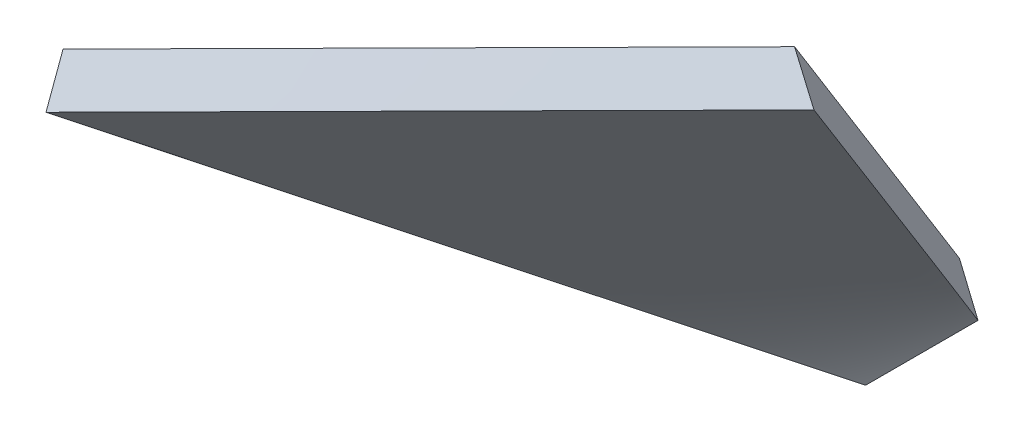
ISO-10303-21;
HEADER;
FILE_DESCRIPTION(('STEP AP214'),'2;1');
FILE_NAME('part.step','',(''),(''),'','','');
FILE_SCHEMA(('AUTOMOTIVE_DESIGN { 1 0 10303 214 1 1 1 1 }'));
ENDSEC;
DATA;
#1=APPLICATION_CONTEXT('core data for automotive mechanical design processes');
#2=APPLICATION_PROTOCOL_DEFINITION('international standard','automotive_design',2000,#1);
#3=PRODUCT_CONTEXT('',#1,'mechanical');
#4=PRODUCT('Part','Part','',(#3));
#5=PRODUCT_RELATED_PRODUCT_CATEGORY('part','',(#4));
#6=PRODUCT_DEFINITION_FORMATION('','',#4);
#7=PRODUCT_DEFINITION_CONTEXT('part definition',#1,'design');
#8=PRODUCT_DEFINITION('design','',#6,#7);
#9=PRODUCT_DEFINITION_SHAPE('','',#8);
#10=(LENGTH_UNIT() NAMED_UNIT(*) SI_UNIT(.MILLI.,.METRE.));
#11=(NAMED_UNIT(*) PLANE_ANGLE_UNIT() SI_UNIT($,.RADIAN.));
#12=(NAMED_UNIT(*) SI_UNIT($,.STERADIAN.) SOLID_ANGLE_UNIT());
#13=UNCERTAINTY_MEASURE_WITH_UNIT(LENGTH_MEASURE(1.E-05),#10,'distance_accuracy_value','');
#14=(GEOMETRIC_REPRESENTATION_CONTEXT(3) GLOBAL_UNCERTAINTY_ASSIGNED_CONTEXT((#13)) GLOBAL_UNIT_ASSIGNED_CONTEXT((#10,
#11,#12)) REPRESENTATION_CONTEXT('',''));
#15=CARTESIAN_POINT('',(0.,0.,0.));
#16=DIRECTION('',(0.,0.,1.));
#17=DIRECTION('',(1.,0.,0.));
#18=AXIS2_PLACEMENT_3D('',#15,#16,#17);
#19=CARTESIAN_POINT('',(-6.22609191666298,361.769121183095,2.73946802342179));
#20=DIRECTION('',(-0.915166256682498,0.0180699960866787,0.402671327351691));
#21=DIRECTION('',(0.402737084534614,0.,0.915315705503057));
#22=AXIS2_PLACEMENT_3D('',#19,#20,#21);
#23=PLANE('',#22);
#24=DIRECTION('',(0.324104895832751,0.626915411174135,0.708472359185315));
#25=VECTOR('',#24,1.);
#26=CARTESIAN_POINT('',(91.5139467042197,44.0928888900743,239.132742342416));
#27=LINE('',#26,#25);
#28=CARTESIAN_POINT('',(84.9758109194033,31.4461867373069,224.84079999998));
#29=VERTEX_POINT('',#28);
#30=CARTESIAN_POINT('',(255.683748074746,361.646186737307,597.997319736598));
#31=VERTEX_POINT('',#30);
#32=EDGE_CURVE('E76',#29,#31,#27,.T.);
#33=ORIENTED_EDGE('',*,*,#32,.T.);
#34=CARTESIAN_POINT('',(252.660470814562,370.070034632344,590.748181243254));
#35=CARTESIAN_POINT('',(252.786295437243,369.718865177392,591.050084969426));
#36=CARTESIAN_POINT('',(252.912138212211,369.36771766812,591.352006657116));
#37=CARTESIAN_POINT('',(253.16386006755,368.665466571563,591.95588594932));
#38=CARTESIAN_POINT('',(253.289739147919,368.314362984277,592.257843553833));
#39=CARTESIAN_POINT('',(253.541533619872,367.612199748406,592.861794685435));
#40=CARTESIAN_POINT('',(253.667449011454,367.261140099821,593.163788212521));
#41=CARTESIAN_POINT('',(253.919316111642,366.559064758072,593.767811195018));
#42=CARTESIAN_POINT('',(254.045267820248,366.208049064908,594.069840650427));
#43=CARTESIAN_POINT('',(254.297207560294,365.506061650728,594.673935495316));
#44=CARTESIAN_POINT('',(254.423195591733,365.155089929712,594.976000884796));
#45=CARTESIAN_POINT('',(254.675207983258,364.453190476563,595.580167603574));
#46=CARTESIAN_POINT('',(254.801232343342,364.102262744428,595.882268932872));
#47=CARTESIAN_POINT('',(255.053317397966,363.400451285779,596.486507537035));
#48=CARTESIAN_POINT('',(255.179378092505,363.049567559265,596.7886448119));
#49=CARTESIAN_POINT('',(255.431535821848,362.347844128601,597.392955312945));
#50=CARTESIAN_POINT('',(255.557632856652,361.997004424452,597.695128539124));
#51=CARTESIAN_POINT('',(255.683748064494,361.646186739859,597.997319743836));
#52=B_SPLINE_CURVE_WITH_KNOTS('',3,(#34,#35,#36,#37,#38,#39,#40,#41,#42,#43,#44,#45,#46,#47,#48,
#49,#50,#51),.UNSPECIFIED.,.F.,.F.,(4,2,2,2,2,2,2,2,4),(0.,1.43968021844362,2.87936038695885,
4.31904051265375,5.75872060264493,7.1984006640563,8.63808070402076,10.0777607296788,
11.5174407481797),.UNSPECIFIED.);
#53=CARTESIAN_POINT('',(252.660470814629,370.070034632494,590.7481812434));
#54=VERTEX_POINT('',#53);
#55=EDGE_CURVE('E206',#54,#31,#52,.T.);
#56=ORIENTED_EDGE('',*,*,#55,.F.);
#57=CARTESIAN_POINT('',(252.607877841896,369.968304155438,590.633216400703));
#58=CARTESIAN_POINT('',(252.6100692319,369.972542927182,590.638006591522));
#59=CARTESIAN_POINT('',(252.612260615543,369.97678169765,590.642796786381));
#60=CARTESIAN_POINT('',(252.616643378325,369.985259237817,590.652377178812));
#61=CARTESIAN_POINT('',(252.618834757465,369.989498007516,590.657167376384));
#62=CARTESIAN_POINT('',(252.623217519803,369.997975548591,590.666747769626));
#63=CARTESIAN_POINT('',(252.625408903001,370.002214319965,590.671537965296));
#64=CARTESIAN_POINT('',(252.629791657491,370.010691860438,590.681118364341));
#65=CARTESIAN_POINT('',(252.631983028783,370.014930629536,590.685908567717));
#66=CARTESIAN_POINT('',(252.636365775217,370.023408169254,590.695488972523));
#67=CARTESIAN_POINT('',(252.638557150359,370.027646939874,590.700279173953));
#68=CARTESIAN_POINT('',(252.642939892818,370.036124479454,590.709859581411));
#69=CARTESIAN_POINT('',(252.645131260135,370.040363248413,590.714649787439));
#70=CARTESIAN_POINT('',(252.649513992975,370.048840786527,590.724230201063));
#71=CARTESIAN_POINT('',(252.651705358498,370.053079555682,590.72902040866));
#72=CARTESIAN_POINT('',(252.656088087227,370.061557093991,590.738600825624));
#73=CARTESIAN_POINT('',(252.658279450433,370.065795863144,590.743391034992));
#74=CARTESIAN_POINT('',(252.66047081216,370.070034632087,590.748181245223));
#75=B_SPLINE_CURVE_WITH_KNOTS('',3,(#57,#58,#59,#60,#61,#62,#63,#64,#65,#66,#67,#68,#69,#70,#71,
#72,#73,#74),.UNSPECIFIED.,.F.,.F.,(4,2,2,2,2,2,2,2,4),(0.,0.0202839280521231,
0.0405678560468412,0.0608517870960308,0.0811357186636942,0.101419652703714,0.121703585782609,
0.14198752082122,0.162271457366975),.UNSPECIFIED.);
#76=CARTESIAN_POINT('',(252.607877841036,369.968304155451,590.633216401594));
#77=VERTEX_POINT('',#76);
#78=EDGE_CURVE('E120',#77,#54,#75,.T.);
#79=ORIENTED_EDGE('',*,*,#78,.F.);
#80=CARTESIAN_POINT('',(252.660470814629,370.070034632494,590.748181243401));
#81=CARTESIAN_POINT('',(250.455464817295,365.804896416015,585.928180608077));
#82=CARTESIAN_POINT('',(248.250426734534,361.5398624806,581.108102371354));
#83=CARTESIAN_POINT('',(243.840276059448,353.010036761755,571.467765690579));
#84=CARTESIAN_POINT('',(241.635163467122,348.745244978327,566.647507246526));
#85=CARTESIAN_POINT('',(237.224853449786,340.215937183471,557.006785180638));
#86=CARTESIAN_POINT('',(235.019656024775,335.951421172043,552.186321558804));
#87=CARTESIAN_POINT('',(230.609163515494,327.422706681706,542.545158111897));
#88=CARTESIAN_POINT('',(228.403868431223,323.158508202795,537.724458286826));
#89=CARTESIAN_POINT('',(223.993057843438,314.630270627772,528.082550529233));
#90=CARTESIAN_POINT('',(221.787542334418,310.366231549558,523.261342583399));
#91=CARTESIAN_POINT('',(217.376379866612,301.838580881307,513.618608757244));
#92=CARTESIAN_POINT('',(215.170732907825,297.57496929127,508.797082876923));
#93=CARTESIAN_POINT('',(210.759284973051,289.048247023974,499.153658596994));
#94=CARTESIAN_POINT('',(208.553483997063,284.785136346718,494.331760197384));
#95=CARTESIAN_POINT('',(204.14170026075,276.259506242119,484.687523717552));
#96=CARTESIAN_POINT('',(201.935717500422,271.996986814784,479.865185637322));
#97=CARTESIAN_POINT('',(197.523536371471,263.472652681133,470.219987831226));
#98=CARTESIAN_POINT('',(195.317338002907,259.210837974629,465.397128105499));
#99=CARTESIAN_POINT('',(190.904681863129,250.688053061476,455.750781202714));
#100=CARTESIAN_POINT('',(188.698224091917,246.427082854824,450.927294025659));
#101=CARTESIAN_POINT('',(184.284994366416,237.906165891374,441.279559688248));
#102=CARTESIAN_POINT('',(182.078222412136,233.646219134551,436.455312527911));
#103=CARTESIAN_POINT('',(177.66429390801,225.127578917922,426.805887880367));
#104=CARTESIAN_POINT('',(175.457137358173,220.868885458088,421.980710393181));
#105=CARTESIAN_POINT('',(171.042451427878,212.353250990596,412.32942943083));
#106=CARTESIAN_POINT('',(168.834922069754,208.096309910131,407.503326009693));
#107=CARTESIAN_POINT('',(164.419266004762,199.584376235877,397.84967411156));
#108=CARTESIAN_POINT('',(162.211139297886,195.329383642115,393.022125634544));
#109=CARTESIAN_POINT('',(157.794125255452,186.821880400319,383.365188593073));
#110=CARTESIAN_POINT('',(155.585237919789,182.569369752632,378.53580002836));
#111=CARTESIAN_POINT('',(151.166480456179,174.067555682236,368.874645344802));
#112=CARTESIAN_POINT('',(148.956610327799,169.818252260941,364.04287922491));
#113=CARTESIAN_POINT('',(145.640863267244,163.447540978023,356.792943857616));
#114=CARTESIAN_POINT('',(144.535472682387,161.324540759327,354.375951407537));
#115=CARTESIAN_POINT('',(142.324315083726,157.079775172932,349.541055568862));
#116=CARTESIAN_POINT('',(141.21854807001,154.958009804948,347.123152180477));
#117=CARTESIAN_POINT('',(139.006577448112,150.715916113335,342.286288651264));
#118=CARTESIAN_POINT('',(137.900373840295,148.59558778851,339.867328511319));
#119=CARTESIAN_POINT('',(135.687456260481,144.356614959386,335.028172745629));
#120=CARTESIAN_POINT('',(134.580742289148,142.237970452903,332.607977121494));
#121=CARTESIAN_POINT('',(132.366590317655,138.002429424244,327.765861904381));
#122=CARTESIAN_POINT('',(131.259152251228,135.885533120048,325.343942151015));
#123=CARTESIAN_POINT('',(129.043562153696,131.654090647833,320.49837452687));
#124=CARTESIAN_POINT('',(127.935410122283,129.53954448083,318.074726655344));
#125=CARTESIAN_POINT('',(125.71825172545,125.313256536575,313.225363387462));
#126=CARTESIAN_POINT('',(124.609245357572,123.201514767438,310.799647985157));
#127=CARTESIAN_POINT('',(122.390203452442,118.98140333445,305.945726824408));
#128=CARTESIAN_POINT('',(121.280167909088,116.873033690798,303.517521051187));
#129=CARTESIAN_POINT('',(119.283913166284,113.087219948977,299.150447407224));
#130=CARTESIAN_POINT('',(118.397919705713,111.409026257041,297.212126219958));
#131=CARTESIAN_POINT('',(116.625009807793,108.05572132754,293.333247835361));
#132=CARTESIAN_POINT('',(115.738093372244,106.38061008398,291.392690642391));
#133=CARTESIAN_POINT('',(113.963180037928,103.034045919622,287.508956478766));
#134=CARTESIAN_POINT('',(113.075183150484,101.362592960989,285.565779535544));
#135=CARTESIAN_POINT('',(111.297912961266,98.0240495115435,281.676328927243));
#136=CARTESIAN_POINT('',(110.408639681858,96.3569589457017,279.730055316362));
#137=CARTESIAN_POINT('',(108.628814593227,93.0284598252007,275.834347349901));
#138=CARTESIAN_POINT('',(107.738263237114,91.367049743198,273.884914092657));
#139=CARTESIAN_POINT('',(105.955309313905,88.0504818829457,269.981559687411));
#140=CARTESIAN_POINT('',(105.062906737537,86.3953241361295,268.027638516924));
#141=CARTESIAN_POINT('',(103.275840028819,83.0925588357623,264.114317435509));
#142=CARTESIAN_POINT('',(102.381175815363,81.4449515591164,262.154917327823));
#143=CARTESIAN_POINT('',(100.58907387438,78.1589271206093,258.229401233657));
#144=CARTESIAN_POINT('',(99.6916359428656,76.5205106608704,256.26328475206));
#145=CARTESIAN_POINT('',(98.1918842520484,73.7971139324413,252.976955970429));
#146=CARTESIAN_POINT('',(97.5904860930799,72.7089459078139,251.658967641181));
#147=CARTESIAN_POINT('',(96.3859858307554,70.5385427193834,249.018852125346));
#148=CARTESIAN_POINT('',(95.7828837024745,69.4563076430533,247.696724878186));
#149=CARTESIAN_POINT('',(94.5747545600541,67.2987724446748,245.047784415299));
#150=CARTESIAN_POINT('',(93.9697276143728,66.2234720800145,243.720971366047));
#151=CARTESIAN_POINT('',(92.7574804430895,64.0809775431069,241.061996750046));
#152=CARTESIAN_POINT('',(92.1502603869884,63.0137827633742,239.729835595788));
#153=CARTESIAN_POINT('',(90.9333037335963,60.8888672075956,237.059368700804));
#154=CARTESIAN_POINT('',(90.3235674009036,59.8311454707194,235.721063604556));
#155=CARTESIAN_POINT('',(89.1011898196953,57.726776694878,233.037354320337));
#156=CARTESIAN_POINT('',(88.4885488976155,56.6801284522175,231.691950928284));
#157=CARTESIAN_POINT('',(87.2591905743576,54.5985826947396,228.99135205953));
#158=CARTESIAN_POINT('',(86.6424695356724,53.5636988358729,227.636147702916));
#159=CARTESIAN_POINT('',(85.405086980354,51.5090918874845,224.916102973331));
#160=CARTESIAN_POINT('',(84.7844255221005,50.489368574094,223.551262743089));
#161=CARTESIAN_POINT('',(83.538527449556,48.467678623066,220.810387317432));
#162=CARTESIAN_POINT('',(82.9132905356514,47.4657131632317,219.434351388219));
#163=CARTESIAN_POINT('',(81.6575055312566,45.4825564222407,216.669276371719));
#164=CARTESIAN_POINT('',(81.0269563578638,44.5013695273999,215.280234626441));
#165=CARTESIAN_POINT('',(79.7596924500353,42.5632241829026,212.487051174908));
#166=CARTESIAN_POINT('',(79.1229751225894,41.6062765937276,211.082903088053));
#167=CARTESIAN_POINT('',(78.162694286581,40.1921857500359,208.963894496968));
#168=CARTESIAN_POINT('',(77.8416042831691,39.7241950952155,208.255142401167));
#169=CARTESIAN_POINT('',(77.1976724718567,38.7960381674455,206.833305696204));
#170=CARTESIAN_POINT('',(76.8748306344671,38.3358720267508,206.120221014085));
#171=CARTESIAN_POINT('',(76.5510686541073,37.8799147545906,205.40485621423));
#172=B_SPLINE_CURVE_WITH_KNOTS('',3,(#80,#81,#82,#83,#84,#85,#86,#87,#88,#89,#90,#91,#92,#93,
#94,#95,#96,#97,#98,#99,#100,#101,#102,#103,#104,#105,#106,#107,#108,#109,#110,#111,#112,#113,
#114,#115,#116,#117,#118,#119,#120,#121,#122,#123,#124,#125,#126,#127,#128,#129,#130,#131,#132,
#133,#134,#135,#136,#137,#138,#139,#140,#141,#142,#143,#144,#145,#146,#147,#148,#149,#150,#151,
#152,#153,#154,#155,#156,#157,#158,#159,#160,#161,#162,#163,#164,#165,#166,#167,#168,#169,#170,
#171),.UNSPECIFIED.,.F.,.F.,(4,2,2,2,2,2,2,2,2,2,2,2,2,2,2,2,2,2,2,2,2,2,2,2,2,2,2,2,2,2,2,2,2,
2,2,2,2,2,2,2,2,2,2,2,2,4),(0.,20.4101140192597,40.8202281152393,61.2303422203503,
81.6404562902559,102.051565153618,122.462674039707,142.87378306066,163.284892419805,
183.695996334394,204.107100167581,224.518203499165,244.929306377516,265.339452205527,
285.749598314205,306.159747275467,326.569905225301,336.774699738519,346.979491900997,
357.184275552171,367.389045943735,377.594939163817,387.800836796681,398.006763897419,
408.212751905308,416.350665006011,424.488562262631,432.626374954806,440.764046750744,
448.899324463151,457.034643020831,465.170257582231,473.306485414557,478.742090952479,
484.177776416413,489.613270669073,495.048353448858,500.482878570664,505.916806758396,
511.356504308613,516.796121453402,522.236098044885,527.677211782932,533.120721781166,
535.844647338766,538.568618892218),.UNSPECIFIED.);
#173=CARTESIAN_POINT('',(76.5509766514666,37.8798220677374,205.404651276164));
#174=VERTEX_POINT('',#173);
#175=EDGE_CURVE('E60',#77,#174,#172,.T.);
#176=ORIENTED_EDGE('',*,*,#175,.T.);
#177=CARTESIAN_POINT('',(84.9822125687129,31.7704022715625,224.84079999998));
#178=CARTESIAN_POINT('',(84.2652422762924,32.1500654593654,223.194277176154));
#179=CARTESIAN_POINT('',(83.5517346550368,32.5634638073492,221.55411021981));
#180=CARTESIAN_POINT('',(82.1332336715688,33.4546729153,218.290236457361));
#181=CARTESIAN_POINT('',(81.4282307590856,33.9324022968673,216.666511597876));
#182=CARTESIAN_POINT('',(80.0229304469749,34.952791635781,213.426842495807));
#183=CARTESIAN_POINT('',(79.322675767781,35.4957722536853,211.810980955821));
#184=CARTESIAN_POINT('',(77.9302247318506,36.6427119152553,208.594835903031));
#185=CARTESIAN_POINT('',(77.2380396541252,37.2467470134385,206.994574611491));
#186=CARTESIAN_POINT('',(76.5506089116107,37.8796284871126,205.403824186521));
#187=B_SPLINE_CURVE_WITH_KNOTS('',3,(#177,#178,#179,#180,#181,#182,#183,#184,#185,#186),
.UNSPECIFIED.,.F.,.F.,(4,2,2,2,4),(0.,5.50620403271491,11.0055070580052,16.5330342474946,
22.0675338861274),.UNSPECIFIED.);
#188=CARTESIAN_POINT('',(84.3974829496179,32.0879287974742,223.497639591484));
#189=VERTEX_POINT('',#188);
#190=EDGE_CURVE('E388',#189,#174,#187,.T.);
#191=ORIENTED_EDGE('',*,*,#190,.F.);
#192=CARTESIAN_POINT('',(85.0549295765274,33.7628232981962,224.916656187421));
#193=CARTESIAN_POINT('',(84.9568443758374,33.5143924299296,224.704882675522));
#194=CARTESIAN_POINT('',(84.8588871393099,33.265651210357,224.493413919692));
#195=CARTESIAN_POINT('',(84.66323548451,32.7675350057807,224.071102165369));
#196=CARTESIAN_POINT('',(84.565541066249,32.5181600207494,223.860259166903));
#197=CARTESIAN_POINT('',(84.2923974661289,31.8190638295863,223.270847593496));
#198=CARTESIAN_POINT('',(84.1172502516846,31.3686184764036,222.892997807561));
#199=CARTESIAN_POINT('',(83.9425599584571,30.9170875281886,222.516235200046));
#200=B_SPLINE_CURVE_WITH_KNOTS('',3,(#192,#193,#194,#195,#196,#197,#198,#199),.UNSPECIFIED.,.F.,
.F.,(4,2,2,4),(0.,1.02258449270982,2.04516902976666,3.88557836153574),.UNSPECIFIED.);
#201=CARTESIAN_POINT('',(84.572881591908,32.5362916286557,223.876128621561));
#202=VERTEX_POINT('',#201);
#203=EDGE_CURVE('E390',#202,#189,#200,.T.);
#204=ORIENTED_EDGE('',*,*,#203,.F.);
#205=DIRECTION('',(0.266763291800911,-0.72175848728003,0.638672085022341));
#206=VECTOR('',#205,1.);
#207=CARTESIAN_POINT('',(76.4433510153192,54.5317293978966,204.412787133135));
#208=LINE('',#207,#206);
#209=EDGE_CURVE('E419',#29,#202,#208,.F.);
#210=ORIENTED_EDGE('',*,*,#209,.F.);
#211=EDGE_LOOP('',(#33,#56,#79,#176,#191,#204,#210));
#212=FACE_BOUND('',#211,.T.);
#213=ADVANCED_FACE('F38',(#212),#23,.T.);
#214=CARTESIAN_POINT('',(-108.724229990897,312.439251428831,147.462223686257));
#215=DIRECTION('',(0.573127406974514,0.259388760360691,-0.777330332852909));
#216=DIRECTION('',(-0.804878930909419,0.,-0.593439050432403));
#217=AXIS2_PLACEMENT_3D('',#214,#215,#216);
#218=PLANE('',#217);
#219=CARTESIAN_POINT('',(85.6116867373077,31.4461867373069,196.981450827299));
#220=CARTESIAN_POINT('',(87.0719563259686,33.2839078969792,198.671343374664));
#221=CARTESIAN_POINT('',(88.5328622001463,35.1209118043416,200.361465715558));
#222=CARTESIAN_POINT('',(91.4557288766099,38.7937293281955,203.742091007913));
#223=CARTESIAN_POINT('',(92.9176896787831,40.6295429448143,205.432593959333));
#224=CARTESIAN_POINT('',(95.8424479246026,44.3002232939045,208.813900752339));
#225=CARTESIAN_POINT('',(97.3052453677012,46.1350900269941,210.504704593727));
#226=CARTESIAN_POINT('',(100.231529953867,49.8040444140138,213.886560821516));
#227=CARTESIAN_POINT('',(101.695017096956,51.6381320679197,215.577613207924));
#228=CARTESIAN_POINT('',(106.086327611059,57.1394344198961,220.651075851717));
#229=CARTESIAN_POINT('',(109.015000421497,60.805688953096,224.033792003557));
#230=CARTESIAN_POINT('',(114.873943308968,68.1363861130635,230.799797357173));
#231=CARTESIAN_POINT('',(117.804213384927,71.8008287410458,234.183086558564));
#232=CARTESIAN_POINT('',(123.665933443328,79.1283792537208,240.95008951616));
#233=CARTESIAN_POINT('',(126.597383425934,82.7914871382284,244.333803272425));
#234=CARTESIAN_POINT('',(132.461176734369,90.1166914411079,251.101551930969));
#235=CARTESIAN_POINT('',(135.393520060239,93.778787859434,254.485586833263));
#236=CARTESIAN_POINT('',(142.725229729155,102.933039680212,262.945971698112));
#237=CARTESIAN_POINT('',(147.125026928383,108.424706945342,268.022476444479));
#238=CARTESIAN_POINT('',(155.925714692369,119.406801670366,278.175878365238));
#239=CARTESIAN_POINT('',(160.326605257069,124.897229130325,283.25277553961));
#240=CARTESIAN_POINT('',(169.129192061475,135.877172760273,293.406859824358));
#241=CARTESIAN_POINT('',(173.530888301345,141.366688930079,298.484046934794));
#242=CARTESIAN_POINT('',(182.334890353051,152.345030193871,308.638639988116));
#243=CARTESIAN_POINT('',(186.737196164897,157.833855287847,313.716045931005));
#244=CARTESIAN_POINT('',(199.94481175737,174.299536078751,328.948513397212));
#245=CARTESIAN_POINT('',(208.750820827786,185.275598697528,339.10382586479));
#246=CARTESIAN_POINT('',(226.364012025771,207.226391286425,359.414871003695));
#247=CARTESIAN_POINT('',(235.171194153233,218.201121256666,369.570603674985));
#248=CARTESIAN_POINT('',(252.839482716995,240.215871186473,389.943614266309));
#249=CARTESIAN_POINT('',(261.700593981795,251.255885667907,400.160893918399));
#250=CARTESIAN_POINT('',(279.423385778047,273.33526871244,420.595657406512));
#251=CARTESIAN_POINT('',(288.285066309499,284.374637275539,430.813141242535));
#252=CARTESIAN_POINT('',(306.008843937193,306.45290479309,451.248259344183));
#253=CARTESIAN_POINT('',(314.870941033495,317.491803747474,461.465893609829));
#254=CARTESIAN_POINT('',(332.595454301163,339.569239542511,481.901276561503));
#255=CARTESIAN_POINT('',(341.457870472527,350.607776383164,492.119025247529));
#256=CARTESIAN_POINT('',(350.320398097041,361.646186737307,502.336813900701));
#257=B_SPLINE_CURVE_WITH_KNOTS('',3,(#219,#220,#221,#222,#223,#224,#225,#226,#227,#228,#229,
#230,#231,#232,#233,#234,#235,#236,#237,#238,#239,#240,#241,#242,#243,#244,#245,#246,#247,#248,
#249,#250,#251,#252,#253,#254,#255,#256),.UNSPECIFIED.,.F.,.F.,(4,2,2,2,2,2,2,2,2,2,2,2,2,2,2,2,
2,2,4),(0.,8.67687040202061,17.3537398763873,26.0306036781871,34.7074677489004,52.061193786794,
69.4149081754379,86.7686249700844,104.122342550636,130.15285758564,156.183371252471,
182.213890169113,208.244409457484,260.305441334685,312.366468448103,364.741521109206,
417.116573785885,469.49163411692,521.86669437124),.UNSPECIFIED.);
#258=CARTESIAN_POINT('',(85.6116867373077,31.4461867373069,196.981450827299));
#259=VERTEX_POINT('',#258);
#260=CARTESIAN_POINT('',(350.320400258716,361.646186737307,502.336811715639));
#261=VERTEX_POINT('',#260);
#262=EDGE_CURVE('E85',#259,#261,#257,.T.);
#263=ORIENTED_EDGE('',*,*,#262,.F.);
#264=CARTESIAN_POINT('',(84.1126884912743,32.6478763111352,196.277230001507));
#265=CARTESIAN_POINT('',(84.376342631706,32.4346507474226,196.400471170861));
#266=CARTESIAN_POINT('',(84.6403379289291,32.222137991493,196.524201734));
#267=CARTESIAN_POINT('',(85.169010836958,31.7985380951999,196.772641647852));
#268=CARTESIAN_POINT('',(85.4336884477639,31.5874509548365,196.897350998563));
#269=CARTESIAN_POINT('',(85.6987072153611,31.3770766222561,197.02254974306));
#270=B_SPLINE_CURVE_WITH_KNOTS('',3,(#264,#265,#266,#267,#268,#269),.UNSPECIFIED.,.F.,.F.,(4,2,
4),(0.,1.0823492808665,2.16469856173302),.UNSPECIFIED.);
#271=CARTESIAN_POINT('',(84.1126884912739,32.6478763111362,196.277230001507));
#272=VERTEX_POINT('',#271);
#273=EDGE_CURVE('E219',#272,#259,#270,.T.);
#274=ORIENTED_EDGE('',*,*,#273,.F.);
#275=CARTESIAN_POINT('',(76.9404436712564,38.3958054281138,192.907154554615));
#276=CARTESIAN_POINT('',(78.1359029599248,37.4379951377876,193.468955941457));
#277=CARTESIAN_POINT('',(79.331319666552,36.4800959043862,194.030696252614));
#278=CARTESIAN_POINT('',(81.7220679398928,34.564119532064,195.154054734913));
#279=CARTESIAN_POINT('',(82.9173995066048,33.6060423931395,195.715672906054));
#280=CARTESIAN_POINT('',(84.1126884912738,32.6478763111364,196.277230001507));
#281=B_SPLINE_CURVE_WITH_KNOTS('',3,(#275,#276,#277,#278,#279,#280),.UNSPECIFIED.,.F.,.F.,(4,2,
4),(0.,4.89482359121515,9.78964728139703),.UNSPECIFIED.);
#282=CARTESIAN_POINT('',(76.9404436719944,38.3958054284489,192.907154560164));
#283=VERTEX_POINT('',#282);
#284=EDGE_CURVE('E134',#283,#272,#281,.T.);
#285=ORIENTED_EDGE('',*,*,#284,.F.);
#286=CARTESIAN_POINT('',(76.9404436719945,38.395805428448,192.907154556921));
#287=CARTESIAN_POINT('',(81.7929076252006,44.4503462488485,198.50523781314));
#288=CARTESIAN_POINT('',(86.6454764812833,50.5047681623346,204.103358736224));
#289=CARTESIAN_POINT('',(96.3507613501414,62.6134451825814,215.299653419316));
#290=CARTESIAN_POINT('',(101.203477362917,68.6677002893421,220.897827179325));
#291=CARTESIAN_POINT('',(115.76175216307,86.8303219106648,237.692393969966));
#292=CARTESIAN_POINT('',(125.467437715139,98.9385447298398,248.888832514518));
#293=CARTESIAN_POINT('',(144.878968164247,123.154809728265,271.281766810967));
#294=CARTESIAN_POINT('',(154.584813061285,135.262851907516,282.478262562862));
#295=CARTESIAN_POINT('',(173.996592613353,159.478834517388,304.871286292739));
#296=CARTESIAN_POINT('',(183.702527268382,171.586774948009,316.06781427072));
#297=CARTESIAN_POINT('',(205.758970811549,199.10155764257,341.51153727214));
#298=CARTESIAN_POINT('',(218.109496460165,214.508380906464,355.758738312958));
#299=CARTESIAN_POINT('',(242.810599076981,245.321969258618,384.253158819907));
#300=CARTESIAN_POINT('',(255.161176045182,260.728734346878,398.500378286038));
#301=CARTESIAN_POINT('',(279.862362675744,291.542227461273,426.994828956451));
#302=CARTESIAN_POINT('',(292.212972338105,306.948955487408,441.242060160733));
#303=CARTESIAN_POINT('',(316.914214561464,337.762385578694,469.736530789546));
#304=CARTESIAN_POINT('',(329.264847122463,353.169087643845,483.983770214078));
#305=CARTESIAN_POINT('',(341.615486236194,368.575782280536,498.231011991138));
#306=B_SPLINE_CURVE_WITH_KNOTS('',3,(#286,#287,#288,#289,#290,#291,#292,#293,#294,#295,#296,
#297,#298,#299,#300,#301,#302,#303,#304,#305),.UNSPECIFIED.,.F.,.F.,(4,2,2,2,2,2,2,2,2,4),(0.,
28.7033388937463,57.4066777810984,114.813355538867,172.220033279852,229.626711025634,
302.674611881064,375.722512740872,448.770413603386,521.818314460314),.UNSPECIFIED.);
#307=CARTESIAN_POINT('',(341.615486236194,368.575782280536,498.231011991137));
#308=VERTEX_POINT('',#307);
#309=EDGE_CURVE('E127',#283,#308,#306,.T.);
#310=ORIENTED_EDGE('',*,*,#309,.T.);
#311=CARTESIAN_POINT('',(342.950585189683,370.241239300408,499.771132816676));
#312=CARTESIAN_POINT('',(342.894955052271,370.171845353865,499.706961669942));
#313=CARTESIAN_POINT('',(342.839325030125,370.102451384965,499.64279044746));
#314=CARTESIAN_POINT('',(342.728065241527,369.963663426102,499.514447866699));
#315=CARTESIAN_POINT('',(342.672435475075,369.89426943614,499.45027650842));
#316=CARTESIAN_POINT('',(342.561176204365,369.755481435527,499.321933650237));
#317=CARTESIAN_POINT('',(342.505546700106,369.686087424875,499.257762150332));
#318=CARTESIAN_POINT('',(342.394287942697,369.5472993822,499.129419019018));
#319=CARTESIAN_POINT('',(342.338658689546,369.477905350176,499.06524738761));
#320=CARTESIAN_POINT('',(342.227400444711,369.339117265322,498.936903983892));
#321=CARTESIAN_POINT('',(342.171771453026,369.269723212492,498.872732211584));
#322=CARTESIAN_POINT('',(342.060513720177,369.130935085568,498.744388536443));
#323=CARTESIAN_POINT('',(342.004884979014,369.061541011474,498.68021663361));
#324=CARTESIAN_POINT('',(341.893627758096,368.922752842354,498.551872687075));
#325=CARTESIAN_POINT('',(341.837999278342,368.853358747327,498.487700643373));
#326=CARTESIAN_POINT('',(341.726742572725,368.714570535689,498.359356421673));
#327=CARTESIAN_POINT('',(341.671114346861,368.645176419076,498.295184243675));
#328=CARTESIAN_POINT('',(341.615486235014,368.575782279905,498.231011991236));
#329=B_SPLINE_CURVE_WITH_KNOTS('',3,(#311,#312,#313,#314,#315,#316,#317,#318,#319,#320,#321,
#322,#323,#324,#325,#326,#327,#328),.UNSPECIFIED.,.F.,.F.,(4,2,2,2,2,2,2,2,4),(0.,
0.329019015721255,0.658037920702536,0.987056714581005,1.31607539775646,1.64509396988677,
1.9741124302872,2.30313077991836,2.63214901992725),.UNSPECIFIED.);
#330=CARTESIAN_POINT('',(342.950585190325,370.241239300415,499.77113281604));
#331=VERTEX_POINT('',#330);
#332=EDGE_CURVE('E112',#308,#331,#329,.F.);
#333=ORIENTED_EDGE('',*,*,#332,.T.);
#334=CARTESIAN_POINT('',(350.32039866144,361.646186078439,502.336814096976));
#335=CARTESIAN_POINT('',(350.013478368287,362.004492172052,502.230064316751));
#336=CARTESIAN_POINT('',(349.706538676195,362.362775931146,502.123295345215));
#337=CARTESIAN_POINT('',(349.092620486924,363.07929876159,501.909719012388));
#338=CARTESIAN_POINT('',(348.785641989744,363.437537832941,501.802911651096));
#339=CARTESIAN_POINT('',(348.171646183087,364.153971269202,501.589258531622));
#340=CARTESIAN_POINT('',(347.864628873608,364.512165634111,501.48241277344));
#341=CARTESIAN_POINT('',(347.250555435142,365.228509638778,501.268682853052));
#342=CARTESIAN_POINT('',(346.943499306153,365.586659278535,501.161798690845));
#343=CARTESIAN_POINT('',(346.329348221456,366.302913814179,500.947991955275));
#344=CARTESIAN_POINT('',(346.022253265747,366.661018710065,500.841069381911));
#345=CARTESIAN_POINT('',(345.408024520398,367.377183739242,500.627185816892));
#346=CARTESIAN_POINT('',(345.100890730758,367.735243872532,500.520224825237));
#347=CARTESIAN_POINT('',(344.486584310336,368.451319357782,500.306264416503));
#348=CARTESIAN_POINT('',(344.179411679554,368.809334709741,500.199264999423));
#349=CARTESIAN_POINT('',(343.56502756964,369.525320613587,499.985227732709));
#350=CARTESIAN_POINT('',(343.257816090506,369.883291165472,499.878189883072));
#351=CARTESIAN_POINT('',(342.950585190194,370.241239300258,499.771132815891));
#352=B_SPLINE_CURVE_WITH_KNOTS('',3,(#334,#335,#336,#337,#338,#339,#340,#341,#342,#343,#344,
#345,#346,#347,#348,#349,#350,#351),.UNSPECIFIED.,.F.,.F.,(4,2,2,2,2,2,2,2,4),(0.,
1.45114077336185,2.90228155449283,4.35342235116975,5.80456317117665,7.25570402230483,
8.70684491235312,10.1579858491274,11.6091268404413),.UNSPECIFIED.);
#353=EDGE_CURVE('E203',#331,#261,#352,.F.);
#354=ORIENTED_EDGE('',*,*,#353,.T.);
#355=EDGE_LOOP('',(#263,#274,#285,#310,#333,#354));
#356=FACE_BOUND('',#355,.T.);
#357=ADVANCED_FACE('F133',(#356),#218,.T.);
#358=CARTESIAN_POINT('',(77.6806174921059,39.7683041554563,217.476696664982));
#359=CARTESIAN_POINT('',(77.1745075386594,38.9389690222923,216.539471310691));
#360=CARTESIAN_POINT('',(76.6660476196011,38.1102650665034,215.602959245173));
#361=CARTESIAN_POINT('',(76.1550441704827,37.2822442775744,214.66721922135));
#362=CARTESIAN_POINT('',(76.1499341359915,37.2739640696851,214.657861821112));
#363=CARTESIAN_POINT('',(76.1448241015003,37.2656838617958,214.648504420873));
#364=CARTESIAN_POINT('',(76.1397140670091,37.2574036539065,214.639147020635));
#365=B_SPLINE_CURVE_WITH_KNOTS('',3,(#358,#359,#360,#361,#362,#363,#364),.UNSPECIFIED.,.F.,.F.,
(4,3,4),(0.,1.,1.01),.UNSPECIFIED.);
#366=DIRECTION('',(-0.610722370638425,0.497359138585639,-0.61615912982535));
#367=VECTOR('',#366,1.);
#368=SURFACE_OF_LINEAR_EXTRUSION('',#365,#367);
#369=CARTESIAN_POINT('',(85.611686910675,31.4461868299457,224.840799918006));
#370=CARTESIAN_POINT('',(85.5684074507404,31.4916079359235,224.800602187246));
#371=CARTESIAN_POINT('',(85.5251278821264,31.5370290278841,224.76040455766));
#372=CARTESIAN_POINT('',(85.4385684170923,31.6278712998511,224.680009397986));
#373=CARTESIAN_POINT('',(85.3952885206717,31.6732924798574,224.639811867899));
#374=CARTESIAN_POINT('',(85.3087284002368,31.7641349278585,224.55941690716));
#375=CARTESIAN_POINT('',(85.2654481762221,31.8095561958533,224.519219476508));
#376=CARTESIAN_POINT('',(85.1788874008114,31.9003988197744,224.438824714575));
#377=CARTESIAN_POINT('',(85.135606849415,31.9458201757007,224.398627383294));
#378=CARTESIAN_POINT('',(85.0490454194534,32.0366629754276,224.318232820037));
#379=CARTESIAN_POINT('',(85.0057645408878,32.0820844192283,224.278035588063));
#380=CARTESIAN_POINT('',(84.9192024568003,32.172927394647,224.197641223354));
#381=CARTESIAN_POINT('',(84.8759212512779,32.218348926265,224.157444090621));
#382=CARTESIAN_POINT('',(84.7893585134893,32.3091920772612,224.077049924331));
#383=CARTESIAN_POINT('',(84.7460769812226,32.3546136966395,224.036852890775));
#384=CARTESIAN_POINT('',(84.6595135901579,32.4454570230993,223.956458922776));
#385=CARTESIAN_POINT('',(84.6162317313594,32.4908787301807,223.916261988333));
#386=CARTESIAN_POINT('',(84.57294976445,32.5363004233152,223.876065154538));
#387=B_SPLINE_CURVE_WITH_KNOTS('',3,(#369,#370,#371,#372,#373,#374,#375,#376,#377,#378,#379,
#380,#381,#382,#383,#384,#385,#386),.UNSPECIFIED.,.F.,.F.,(4,2,2,2,2,2,2,2,4),(0.,
0.223536159732502,0.447072890655168,0.670610192401204,0.894148064604167,1.11768650689728,
1.34122551891395,1.56476510028748,1.78830525065128),.UNSPECIFIED.);
#388=CARTESIAN_POINT('',(85.6116867373077,31.4461867373069,224.84079999998));
#389=VERTEX_POINT('',#388);
#390=EDGE_CURVE('E354',#202,#389,#387,.F.);
#391=ORIENTED_EDGE('',*,*,#390,.F.);
#392=ORIENTED_EDGE('',*,*,#203,.T.);
#393=CARTESIAN_POINT('',(84.397490448743,32.0879215315775,223.497629208775));
#394=CARTESIAN_POINT('',(84.4481729005656,32.0604547990095,223.553460021752));
#395=CARTESIAN_POINT('',(84.4988608053227,32.0330698680742,223.609326129488));
#396=CARTESIAN_POINT('',(84.6002091384026,31.9784846591831,223.721086771247));
#397=CARTESIAN_POINT('',(84.6508695587059,31.9512842578032,223.776981252259));
#398=CARTESIAN_POINT('',(84.7521629018019,31.8970681134066,223.888798647091));
#399=CARTESIAN_POINT('',(84.802795816814,31.8700522474719,223.94472150836));
#400=CARTESIAN_POINT('',(84.904034127485,31.8162051791807,224.056595669623));
#401=CARTESIAN_POINT('',(84.9546395156013,31.7893738544187,224.112546917527));
#402=CARTESIAN_POINT('',(85.0558227505861,31.7358958738024,224.224477858233));
#403=CARTESIAN_POINT('',(85.1064005901483,31.7092490960615,224.280457499405));
#404=CARTESIAN_POINT('',(85.2075287058422,31.6561402148312,224.392445232789));
#405=CARTESIAN_POINT('',(85.2580789749028,31.6296779899805,224.448453273832));
#406=CARTESIAN_POINT('',(85.3591519273583,31.576938220003,224.560497813353));
#407=CARTESIAN_POINT('',(85.4096746039159,31.5506605540464,224.616534261123));
#408=CARTESIAN_POINT('',(85.5106923483798,31.4982899071017,224.728635619886));
#409=CARTESIAN_POINT('',(85.5611874096818,31.4721968058217,224.784700480632));
#410=CARTESIAN_POINT('',(85.6116868868969,31.4461866602598,224.840799829601));
#411=B_SPLINE_CURVE_WITH_KNOTS('',3,(#393,#394,#395,#396,#397,#398,#399,#400,#401,#402,#403,
#404,#405,#406,#407,#408,#409,#410),.UNSPECIFIED.,.F.,.F.,(4,2,2,2,2,2,2,2,4),(0.,
0.240752746148179,0.48132436005875,0.721716005925893,0.961928850439385,1.20196406277985,
1.44182281461343,1.68150628008648,1.92101563582025),.UNSPECIFIED.);
#412=EDGE_CURVE('E355',#189,#389,#411,.T.);
#413=ORIENTED_EDGE('',*,*,#412,.T.);
#414=EDGE_LOOP('',(#391,#392,#413));
#415=FACE_BOUND('',#414,.T.);
#416=ADVANCED_FACE('F160',(#415),#368,.F.);
#417=CARTESIAN_POINT('',(-34.9249999999667,31.4461867373069,224.84079999998));
#418=DIRECTION('',(0.,0.662686464342369,0.748896955513514));
#419=DIRECTION('',(1.,0.,0.));
#420=AXIS2_PLACEMENT_3D('',#417,#418,#419);
#421=PLANE('',#420);
#422=DIRECTION('',(1.,0.,0.));
#423=VECTOR('',#422,1.);
#424=CARTESIAN_POINT('',(-34.9249999999667,31.4461867373069,224.84079999998));
#425=LINE('',#424,#423);
#426=EDGE_CURVE('E223',#29,#389,#425,.T.);
#427=ORIENTED_EDGE('',*,*,#426,.F.);
#428=ORIENTED_EDGE('',*,*,#209,.T.);
#429=ORIENTED_EDGE('',*,*,#390,.T.);
#430=EDGE_LOOP('',(#427,#428,#429));
#431=FACE_BOUND('',#430,.T.);
#432=ADVANCED_FACE('F406',(#431),#421,.F.);
#433=CARTESIAN_POINT('',(0.,64.8697592964189,262.612526266856));
#434=DIRECTION('',(0.,0.748896955513514,-0.662686464342369));
#435=DIRECTION('',(0.,0.662686464342369,0.748896955513514));
#436=AXIS2_PLACEMENT_3D('',#433,#434,#435);
#437=PLANE('',#436);
#438=ORIENTED_EDGE('',*,*,#32,.F.);
#439=ORIENTED_EDGE('',*,*,#426,.T.);
#440=DIRECTION('',(0.323023809091136,0.627160398498757,0.708749217505835));
#441=VECTOR('',#440,1.);
#442=CARTESIAN_POINT('',(85.6116867373077,31.4461867373069,224.84079999998));
#443=LINE('',#442,#441);
#444=EDGE_CURVE('E121',#389,#31,#443,.T.);
#445=ORIENTED_EDGE('',*,*,#444,.T.);
#446=EDGE_LOOP('',(#438,#439,#445));
#447=FACE_BOUND('',#446,.T.);
#448=ADVANCED_FACE('F414',(#447),#437,.F.);
#449=CARTESIAN_POINT('',(85.7104778066998,31.3953036336931,224.84079999998));
#450=CARTESIAN_POINT('',(85.7066358554148,31.3878443702238,215.319611182266));
#451=CARTESIAN_POINT('',(85.7024328717195,31.3817222268896,205.798420188865));
#452=CARTESIAN_POINT('',(85.6983904559327,31.3766796815384,196.277230001507));
#453=CARTESIAN_POINT('',(85.6116867373077,31.4461867373069,224.84079999998));
#454=CARTESIAN_POINT('',(85.6116867373077,31.4461867373069,215.319610000489));
#455=CARTESIAN_POINT('',(85.6116867373077,31.4461867373069,205.798420000998));
#456=CARTESIAN_POINT('',(85.6116867373077,31.4461867373069,196.277230001507));
#457=CARTESIAN_POINT('',(75.7325797980967,36.5344970986776,224.84079999998));
#458=CARTESIAN_POINT('',(76.1167749265944,37.2804234456172,215.319491822811));
#459=CARTESIAN_POINT('',(76.5370732961312,37.8926377790306,205.798401214307));
#460=CARTESIAN_POINT('',(76.9413148748088,38.3968923141521,196.277230001507));
#461=B_SPLINE_SURFACE_WITH_KNOTS('',1,3,((#449,#450,#451,#452),(#453,#454,#455,#456),(#457,#458,
#459,#460)),.UNSPECIFIED.,.F.,.F.,.F.,(2,1,2),(4,4),(-0.01,0.,1.),(-0.0142817849992367,
0.0142817849992367),.UNSPECIFIED.);
#462=CARTESIAN_POINT('',(76.5506839644641,37.8795205180963,205.404425101961));
#463=CARTESIAN_POINT('',(76.5670227121929,37.9025246918352,205.024136601754));
#464=CARTESIAN_POINT('',(76.5833629354123,37.9253442138732,204.643836998463));
#465=CARTESIAN_POINT('',(76.6160387270906,37.9706158479508,203.883237799444));
#466=CARTESIAN_POINT('',(76.6323742957639,37.9930679811277,203.502938204984));
#467=CARTESIAN_POINT('',(76.6650341306198,38.0376081179251,202.742338987493));
#468=CARTESIAN_POINT('',(76.6813583973934,38.0596961422152,202.362039365698));
#469=CARTESIAN_POINT('',(76.7139889801713,38.103511342447,201.601440054977));
#470=CARTESIAN_POINT('',(76.7302952971331,38.1252385386038,201.221140367256));
#471=CARTESIAN_POINT('',(76.7628833321297,38.1683353635668,200.460540886803));
#472=CARTESIAN_POINT('',(76.7791650514792,38.1897050121462,200.080241095247));
#473=CARTESIAN_POINT('',(76.8116972429942,38.2320900230575,199.319641368944));
#474=CARTESIAN_POINT('',(76.8279477168226,38.2531054047324,198.939341435345));
#475=CARTESIAN_POINT('',(76.8604107691481,38.2947851627626,198.178741387285));
#476=CARTESIAN_POINT('',(76.8766233496474,38.3154495580421,197.798441273945));
#477=CARTESIAN_POINT('',(76.9090039666603,38.3564306248434,197.037840826986));
#478=CARTESIAN_POINT('',(76.9251720055071,38.3767473148813,196.657540494464));
#479=CARTESIAN_POINT('',(76.9413148748088,38.3968923141521,196.277230001507));
#480=B_SPLINE_CURVE_WITH_KNOTS('',3,(#462,#463,#464,#465,#466,#467,#468,#469,#470,#471,#472,
#473,#474,#475,#476,#477,#478,#479),.UNSPECIFIED.,.F.,.F.,(4,2,2,2,2,2,2,2,4),(0.,
1.1440014409214,2.28793682959915,3.43180705422749,4.57561297672882,5.71935543404311,
6.8630352394176,8.00665318369729,9.15021003661592),.UNSPECIFIED.);
#481=CARTESIAN_POINT('',(76.9413148748088,38.3968923141521,196.277230001507));
#482=VERTEX_POINT('',#481);
#483=EDGE_CURVE('E130',#174,#482,#480,.T.);
#484=CARTESIAN_POINT('',(76.9413148748088,38.3968923141521,196.277230001507));
#485=CARTESIAN_POINT('',(85.6116867373077,31.4461867373069,196.277230001507));
#486=CARTESIAN_POINT('',(85.6983904559327,31.3766796815384,196.277230001507));
#487=B_SPLINE_CURVE_WITH_KNOTS('',1,(#484,#485,#486),.UNSPECIFIED.,.F.,.F.,(2,1,2),(-0.01,0.99,
1.),.UNSPECIFIED.);
#488=EDGE_CURVE('E351',#482,#272,#487,.T.);
#489=CARTESIAN_POINT('',(85.6116867373077,31.4461867373069,224.84079999998));
#490=CARTESIAN_POINT('',(85.6116867373077,31.4461867373069,220.080205000235));
#491=CARTESIAN_POINT('',(85.6116867373077,31.4461867373069,215.319610000489));
#492=CARTESIAN_POINT('',(85.6116867373077,31.4461867373069,205.798420000998));
#493=CARTESIAN_POINT('',(85.6116867373077,31.4461867373069,201.037825001252));
#494=CARTESIAN_POINT('',(85.6116867373077,31.4461867373069,196.277230001507));
#495=B_SPLINE_CURVE_WITH_KNOTS('',3,(#489,#490,#491,#492,#493,#494),.UNSPECIFIED.,.F.,.F.,(4,2,
4),(0.,0.5,1.),.UNSPECIFIED.);
#496=EDGE_CURVE('E216',#389,#259,#495,.T.);
#497=ORIENTED_EDGE('',*,*,#412,.F.);
#498=ORIENTED_EDGE('',*,*,#190,.T.);
#499=ORIENTED_EDGE('',*,*,#483,.T.);
#500=ORIENTED_EDGE('',*,*,#488,.T.);
#501=ORIENTED_EDGE('',*,*,#273,.T.);
#502=ORIENTED_EDGE('',*,*,#496,.F.);
#503=EDGE_LOOP('',(#497,#498,#499,#500,#501,#502));
#504=FACE_BOUND('',#503,.T.);
#505=ADVANCED_FACE('F244',(#504),#461,.T.);
#506=CARTESIAN_POINT('',(350.370436228139,361.560193281437,502.386312149339));
#507=CARTESIAN_POINT('',(318.825382833219,361.560765874498,534.273640166434));
#508=CARTESIAN_POINT('',(287.280339313096,361.561364059424,566.160977952631));
#509=CARTESIAN_POINT('',(255.735305589178,361.56199049302,598.048325430188));
#510=CARTESIAN_POINT('',(255.419855251939,361.561996757356,598.367198904963));
#511=CARTESIAN_POINT('',(255.1044049147,361.562003021692,598.686072379739));
#512=CARTESIAN_POINT('',(254.788954577461,361.562009286028,599.004945854514));
#513=CARTESIAN_POINT('',(350.320400258716,361.646186737307,502.336811715639));
#514=CARTESIAN_POINT('',(318.774849530726,361.646186737307,534.223647722626));
#515=CARTESIAN_POINT('',(287.229298802736,361.646186737307,566.110483729612));
#516=CARTESIAN_POINT('',(255.683748074746,361.646186737307,597.997319736598));
#517=CARTESIAN_POINT('',(255.368292567466,361.646186737307,598.316188096668));
#518=CARTESIAN_POINT('',(255.052837060187,361.646186737307,598.635056456738));
#519=CARTESIAN_POINT('',(254.737381552907,361.646186737307,598.953924816808));
#520=CARTESIAN_POINT('',(345.316803316451,370.245532324333,497.386768345703));
#521=CARTESIAN_POINT('',(313.721519281392,370.188273018238,529.224403341747));
#522=CARTESIAN_POINT('',(282.125247766782,370.128454525639,561.06106142766));
#523=CARTESIAN_POINT('',(250.527996631561,370.065811166007,592.896750377622));
#524=CARTESIAN_POINT('',(250.212024120208,370.065184732411,593.215107267122));
#525=CARTESIAN_POINT('',(249.896051608856,370.064558298814,593.533464156621));
#526=CARTESIAN_POINT('',(249.580079097504,370.063931865218,593.851821046121));
#527=B_SPLINE_SURFACE_WITH_KNOTS('',1,3,((#506,#507,#508,#509,#510,#511,#512),(#513,#514,#515,
#516,#517,#518,#519),(#520,#521,#522,#523,#524,#525,#526)),.UNSPECIFIED.,.F.,.F.,.F.,(2,1,2),(4,
3,4),(-0.01,0.,1.),(-0.0672811800049193,0.0672811800049199,0.0686268036050183),.UNSPECIFIED.);
#528=CARTESIAN_POINT('',(342.950585190186,370.241239300255,499.771132815903));
#529=CARTESIAN_POINT('',(339.188608727701,370.234406346011,503.561953717934));
#530=CARTESIAN_POINT('',(335.426618322866,370.22753701609,507.352760718155));
#531=CARTESIAN_POINT('',(327.902609546173,370.213724707748,514.934347050913));
#532=CARTESIAN_POINT('',(324.140591174314,370.206781729326,518.725126383451));
#533=CARTESIAN_POINT('',(316.616526490101,370.19282122703,526.306657407095));
#534=CARTESIAN_POINT('',(312.854480177746,370.185803703154,530.097409098201));
#535=CARTESIAN_POINT('',(305.330359639072,370.171693212999,537.678884865227));
#536=CARTESIAN_POINT('',(301.568285412753,370.164600246719,541.469608941145));
#537=CARTESIAN_POINT('',(294.044109072685,370.150337974802,549.051029504044));
#538=CARTESIAN_POINT('',(290.282006958934,370.143168669164,552.841725991022));
#539=CARTESIAN_POINT('',(282.757774870535,370.128752821582,560.423091402286));
#540=CARTESIAN_POINT('',(278.995644895886,370.121506279636,564.213760326569));
#541=CARTESIAN_POINT('',(271.471357112219,370.106935062485,571.795070638691));
#542=CARTESIAN_POINT('',(267.709199303202,370.099610387277,575.585712026527));
#543=CARTESIAN_POINT('',(260.184855877336,370.084882006654,583.166967291995));
#544=CARTESIAN_POINT('',(256.422670260488,370.077478301234,586.957581169625));
#545=CARTESIAN_POINT('',(252.660470814515,370.070034632356,590.748181243287));
#546=B_SPLINE_CURVE_WITH_KNOTS('',3,(#528,#529,#530,#531,#532,#533,#534,#535,#536,#537,#538,
#539,#540,#541,#542,#543,#544,#545),.UNSPECIFIED.,.F.,.F.,(4,2,2,2,2,2,2,2,4),(0.,
16.0220326531621,32.0440657771859,48.0660993793417,64.08813346701,80.1101680476827,
96.1322031289648,112.154238718576,128.176274824351),.UNSPECIFIED.);
#547=EDGE_CURVE('E11',#331,#54,#546,.T.);
#548=CARTESIAN_POINT('',(350.320400258716,361.646186737307,502.336811715639));
#549=CARTESIAN_POINT('',(334.547624894721,361.646186737307,518.280229719132));
#550=CARTESIAN_POINT('',(318.774849530726,361.646186737307,534.223647722625));
#551=CARTESIAN_POINT('',(287.229298802736,361.646186737307,566.110483729611));
#552=CARTESIAN_POINT('',(271.456523438741,361.646186737307,582.053901733105));
#553=CARTESIAN_POINT('',(255.683748074746,361.646186737307,597.997319736598));
#554=B_SPLINE_CURVE_WITH_KNOTS('',3,(#548,#549,#550,#551,#552,#553),.UNSPECIFIED.,.F.,.F.,(4,2,
4),(0.,0.5,1.),.UNSPECIFIED.);
#555=EDGE_CURVE('E212',#261,#31,#554,.T.);
#556=ORIENTED_EDGE('',*,*,#353,.F.);
#557=ORIENTED_EDGE('',*,*,#547,.T.);
#558=ORIENTED_EDGE('',*,*,#55,.T.);
#559=ORIENTED_EDGE('',*,*,#555,.F.);
#560=EDGE_LOOP('',(#556,#557,#558,#559));
#561=FACE_BOUND('',#560,.T.);
#562=ADVANCED_FACE('F243',(#561),#527,.T.);
#563=CARTESIAN_POINT('',(85.6116867373077,31.4461867373069,224.84079999998));
#564=CARTESIAN_POINT('',(255.683748074746,361.646186737307,597.997319736598));
#565=CARTESIAN_POINT('',(85.6116867373077,31.4461867373069,220.080205000235));
#566=CARTESIAN_POINT('',(271.456523438741,361.646186737307,582.053901733105));
#567=CARTESIAN_POINT('',(85.6116867373077,31.4461867373069,215.319610000489));
#568=CARTESIAN_POINT('',(287.229298802736,361.646186737307,566.110483729611));
#569=CARTESIAN_POINT('',(85.6116867373077,31.4461867373069,205.798420000998));
#570=CARTESIAN_POINT('',(318.774849530726,361.646186737307,534.223647722625));
#571=CARTESIAN_POINT('',(85.6116867373077,31.4461867373069,201.037825001252));
#572=CARTESIAN_POINT('',(334.547624894721,361.646186737307,518.280229719132));
#573=CARTESIAN_POINT('',(85.6116867373077,31.4461867373069,196.277230001507));
#574=CARTESIAN_POINT('',(350.320400258716,361.646186737307,502.336811715639));
#575=B_SPLINE_SURFACE_WITH_KNOTS('',3,1,((#563,#564),(#565,#566),(#567,#568),(#569,#570),(#571,
#572),(#573,#574)),.UNSPECIFIED.,.F.,.F.,.F.,(4,2,4),(2,2),(0.,0.5,1.),(0.,1.),.UNSPECIFIED.);
#576=OFFSET_SURFACE('',#575,-11.1125,.F.);
#577=ORIENTED_EDGE('',*,*,#175,.F.);
#578=ORIENTED_EDGE('',*,*,#78,.T.);
#579=ORIENTED_EDGE('',*,*,#547,.F.);
#580=ORIENTED_EDGE('',*,*,#332,.F.);
#581=CARTESIAN_POINT('',(76.9413148748013,38.3968923141428,196.277230001493));
#582=CARTESIAN_POINT('',(76.9604883772408,38.4208095115488,196.297895520583));
#583=CARTESIAN_POINT('',(76.9796615527585,38.4447263092288,196.318561806395));
#584=CARTESIAN_POINT('',(79.3586227697478,41.4122656827842,198.882923171121));
#585=CARTESIAN_POINT('',(81.7134664085888,44.3498424947366,201.438213437159));
#586=CARTESIAN_POINT('',(86.4151739773083,50.2151750099396,206.567378154687));
#587=CARTESIAN_POINT('',(88.7620378423172,53.1429306333488,209.141252756726));
#588=CARTESIAN_POINT('',(93.4493563202057,58.9905158662341,214.30382171054));
#589=CARTESIAN_POINT('',(95.7898109099964,61.9103454471569,216.892516115601));
#590=CARTESIAN_POINT('',(100.465642587916,67.7437021397768,222.081835201588));
#591=CARTESIAN_POINT('',(102.801019496822,70.6572290289957,224.682460293861));
#592=CARTESIAN_POINT('',(107.467596726526,76.4790821515787,229.893221948407));
#593=CARTESIAN_POINT('',(109.798797066244,79.3874084085019,232.50335846743));
#594=CARTESIAN_POINT('',(114.457806498075,85.1998271769207,237.731349376892));
#595=CARTESIAN_POINT('',(116.785615593996,88.103919693172,240.349203758652));
#596=CARTESIAN_POINT('',(121.656109224827,94.1801650133129,245.836437726467));
#597=CARTESIAN_POINT('',(124.198521782397,97.3519775039606,248.706435438733));
#598=CARTESIAN_POINT('',(129.280649688015,103.692220279907,254.45254935314));
#599=CARTESIAN_POINT('',(131.820365035275,106.860650564218,257.328665557066));
#600=CARTESIAN_POINT('',(136.897587383272,113.194736649315,263.085920848567));
#601=CARTESIAN_POINT('',(139.435094377901,116.360392442427,265.967059949968));
#602=CARTESIAN_POINT('',(144.508272088526,122.689393135665,271.733490475565));
#603=CARTESIAN_POINT('',(147.043942804302,125.852738035514,274.618781900257));
#604=CARTESIAN_POINT('',(152.113751443532,132.177495878028,280.392837866025));
#605=CARTESIAN_POINT('',(154.647889364944,135.338908818118,283.281602411712));
#606=CARTESIAN_POINT('',(159.714867304323,141.660096589936,289.062060724181));
#607=CARTESIAN_POINT('',(162.247707322219,144.819871421573,291.953754491124));
#608=CARTESIAN_POINT('',(169.844495054491,154.297007973943,300.632451971761));
#609=CARTESIAN_POINT('',(174.906796155603,160.612288675884,306.423169527406));
#610=CARTESIAN_POINT('',(185.02815229477,173.238738413202,318.011885941095));
#611=CARTESIAN_POINT('',(190.087207338797,179.549907456142,323.809884785688));
#612=CARTESIAN_POINT('',(200.202853807877,192.169119017474,335.411423803281));
#613=CARTESIAN_POINT('',(205.259445233946,198.477161537156,341.214963973992));
#614=CARTESIAN_POINT('',(214.923374820979,210.532764728225,352.312633852313));
#615=CARTESIAN_POINT('',(219.530874516237,216.280530744286,357.606399865969));
#616=CARTESIAN_POINT('',(228.744594165704,227.774433747762,368.196819211513));
#617=CARTESIAN_POINT('',(233.350814119414,233.520570734541,373.493472544525));
#618=CARTESIAN_POINT('',(242.562206875969,245.011510163279,384.089138506332));
#619=CARTESIAN_POINT('',(247.167379678696,250.756312605087,389.388151135392));
#620=CARTESIAN_POINT('',(256.376869280665,262.244825058612,399.988142532007));
#621=CARTESIAN_POINT('',(260.981186077756,267.988535067586,405.289121304403));
#622=CARTESIAN_POINT('',(270.189093325651,279.475027501583,415.892712506044));
#623=CARTESIAN_POINT('',(274.792683776541,285.217809926716,421.195324935094));
#624=CARTESIAN_POINT('',(283.999250888981,296.702590226215,431.801931530073));
#625=CARTESIAN_POINT('',(288.602227550551,302.444588100606,437.105925695957));
#626=CARTESIAN_POINT('',(300.109014020304,316.798744705907,450.367377216853));
#627=CARTESIAN_POINT('',(307.012497648884,325.410486158495,458.325569251193));
#628=CARTESIAN_POINT('',(320.818528521177,342.632769804988,474.244063755028));
#629=CARTESIAN_POINT('',(327.721075764854,351.243311998846,482.204366224606));
#630=CARTESIAN_POINT('',(341.525392357196,368.463399796907,498.12665894456));
#631=CARTESIAN_POINT('',(348.427161707963,377.072945403804,506.088649190199));
#632=CARTESIAN_POINT('',(362.230070135117,394.291227985824,522.01404905276));
#633=CARTESIAN_POINT('',(369.131209211537,402.899964960989,529.97745866961));
#634=CARTESIAN_POINT('',(376.032097754566,411.508380114536,537.94143315549));
#635=B_SPLINE_CURVE_WITH_KNOTS('',3,(#581,#582,#583,#584,#585,#586,#587,#588,#589,#590,#591,
#592,#593,#594,#595,#596,#597,#598,#599,#600,#601,#602,#603,#604,#605,#606,#607,#608,#609,#610,
#611,#612,#613,#614,#615,#616,#617,#618,#619,#620,#621,#622,#623,#624,#625,#626,#627,#628,#629,
#630,#631,#632,#633,#634),.UNSPECIFIED.,.F.,.F.,(4,2,2,2,2,2,2,2,2,2,2,2,2,2,2,2,2,2,2,2,2,2,2,
2,2,2,4),(0.,0.110907498170618,13.7613682454364,27.4119396967149,41.0625602587319,
54.713655056911,68.3646878577372,82.0157053128388,96.9438691544473,111.872037351693,
126.800246704185,141.72845784203,156.656688825195,171.58492063618,201.440879433589,
231.296783158819,261.152674550961,288.36679574902,315.580927561383,342.795062451438,
370.009264802765,397.223463892415,424.437662091216,465.258942692103,506.080224896997,
546.90139403311,587.722561072148),.UNSPECIFIED.);
#636=EDGE_CURVE('E52',#482,#308,#635,.T.);
#637=ORIENTED_EDGE('',*,*,#636,.F.);
#638=ORIENTED_EDGE('',*,*,#483,.F.);
#639=EDGE_LOOP('',(#577,#578,#579,#580,#637,#638));
#640=FACE_BOUND('',#639,.T.);
#641=ADVANCED_FACE('F115',(#640),#576,.F.);
#642=CARTESIAN_POINT('',(85.6116867373077,31.4461867373069,196.277230001507));
#643=CARTESIAN_POINT('',(85.6116867373077,31.4461867373069,163.808233537469));
#644=CARTESIAN_POINT('',(85.6116867373077,31.4461867373069,131.339237073432));
#645=CARTESIAN_POINT('',(85.6116867373077,31.4461867373069,98.8702406093947));
#646=CARTESIAN_POINT('',(76.9413148748088,38.3968923141521,196.277230001507));
#647=CARTESIAN_POINT('',(76.9329214572068,38.3864222904974,163.808233537469));
#648=CARTESIAN_POINT('',(76.9245226279307,38.3759066566038,131.339237073432));
#649=CARTESIAN_POINT('',(76.9161186737156,38.365345089407,98.8702406093947));
#650=B_SPLINE_SURFACE_WITH_KNOTS('',1,3,((#642,#643,#644,#645),(#646,#647,#648,#649)),
.UNSPECIFIED.,.F.,.F.,.F.,(2,2),(4,4),(0.,1.),(-0.048703494696056,0.0487034946960561),.UNSPECIFIED.);
#651=CARTESIAN_POINT('',(76.9413148748088,38.3968923141521,196.277230001507));
#652=CARTESIAN_POINT('',(76.9329214572068,38.3864222904974,163.808233537469));
#653=CARTESIAN_POINT('',(76.9245226279307,38.3759066566038,131.339237073432));
#654=CARTESIAN_POINT('',(76.9161186737156,38.365345089407,98.8702406093947));
#655=B_SPLINE_CURVE_WITH_KNOTS('',3,(#651,#652,#653,#654),.UNSPECIFIED.,.F.,.F.,(4,4),
(-0.048703494696056,0.0487034946960561),.UNSPECIFIED.);
#656=EDGE_CURVE('E128',#482,#283,#655,.T.);
#657=ORIENTED_EDGE('',*,*,#656,.T.);
#658=ORIENTED_EDGE('',*,*,#284,.T.);
#659=ORIENTED_EDGE('',*,*,#488,.F.);
#660=EDGE_LOOP('',(#657,#658,#659));
#661=FACE_BOUND('',#660,.T.);
#662=ADVANCED_FACE('F242',(#661),#650,.T.);
#663=CARTESIAN_POINT('',(85.6116867373077,31.4461867373069,196.277230001507));
#664=CARTESIAN_POINT('',(350.320400258716,361.646186737307,502.336811715639));
#665=CARTESIAN_POINT('',(85.6116867373077,31.4461867373069,180.042731769488));
#666=CARTESIAN_POINT('',(349.992904928856,361.646186737307,425.857143121575));
#667=CARTESIAN_POINT('',(85.6116867373077,31.4461867373069,163.808233537469));
#668=CARTESIAN_POINT('',(349.665409598995,361.646186737307,349.377474527511));
#669=CARTESIAN_POINT('',(85.6116867373077,31.4461867373069,131.339237073432));
#670=CARTESIAN_POINT('',(349.010418939275,361.646186737307,196.418137339381));
#671=CARTESIAN_POINT('',(85.6116867373077,31.4461867373069,115.104738841413));
#672=CARTESIAN_POINT('',(348.682923609414,361.646186737307,119.938468745316));
#673=CARTESIAN_POINT('',(85.6116867373077,31.4461867373069,98.8702406093947));
#674=CARTESIAN_POINT('',(348.355428279554,361.646186737307,43.4588001512512));
#675=B_SPLINE_SURFACE_WITH_KNOTS('',3,1,((#663,#664),(#665,#666),(#667,#668),(#669,#670),(#671,
#672),(#673,#674)),.UNSPECIFIED.,.F.,.F.,.F.,(4,2,4),(2,2),(0.,0.5,1.),(0.,1.),.UNSPECIFIED.);
#676=OFFSET_SURFACE('',#675,-11.1125,.F.);
#677=ORIENTED_EDGE('',*,*,#309,.F.);
#678=ORIENTED_EDGE('',*,*,#656,.F.);
#679=ORIENTED_EDGE('',*,*,#636,.T.);
#680=EDGE_LOOP('',(#677,#678,#679));
#681=FACE_BOUND('',#680,.T.);
#682=ADVANCED_FACE('F126',(#681),#676,.F.);
#683=CARTESIAN_POINT('',(85.6116867373077,31.4461867373069,224.84079999998));
#684=CARTESIAN_POINT('',(255.683748074746,361.646186737307,597.997319736598));
#685=CARTESIAN_POINT('',(85.6116867373077,31.4461867373069,220.080205000235));
#686=CARTESIAN_POINT('',(271.456523438741,361.646186737307,582.053901733105));
#687=CARTESIAN_POINT('',(85.6116867373077,31.4461867373069,215.319610000489));
#688=CARTESIAN_POINT('',(287.229298802736,361.646186737307,566.110483729611));
#689=CARTESIAN_POINT('',(85.6116867373077,31.4461867373069,205.798420000998));
#690=CARTESIAN_POINT('',(318.774849530726,361.646186737307,534.223647722625));
#691=CARTESIAN_POINT('',(85.6116867373077,31.4461867373069,201.037825001252));
#692=CARTESIAN_POINT('',(334.547624894721,361.646186737307,518.280229719132));
#693=CARTESIAN_POINT('',(85.6116867373077,31.4461867373069,196.277230001507));
#694=CARTESIAN_POINT('',(350.320400258716,361.646186737307,502.336811715639));
#695=B_SPLINE_SURFACE_WITH_KNOTS('',3,1,((#683,#684),(#685,#686),(#687,#688),(#689,#690),(#691,
#692),(#693,#694)),.UNSPECIFIED.,.F.,.F.,.F.,(4,2,4),(2,2),(0.,0.5,1.),(0.,1.),.UNSPECIFIED.);
#696=ORIENTED_EDGE('',*,*,#496,.T.);
#697=ORIENTED_EDGE('',*,*,#262,.T.);
#698=ORIENTED_EDGE('',*,*,#555,.T.);
#699=ORIENTED_EDGE('',*,*,#444,.F.);
#700=EDGE_LOOP('',(#696,#697,#698,#699));
#701=FACE_BOUND('',#700,.T.);
#702=ADVANCED_FACE('F210',(#701),#695,.T.);
#703=CLOSED_SHELL('',(#213,#357,#416,#432,#448,#505,#562,#641,#662,#682,#702));
#704=MANIFOLD_SOLID_BREP('B2',#703);
#705=ADVANCED_BREP_SHAPE_REPRESENTATION('',(#18,#704),#14);
#706=SHAPE_DEFINITION_REPRESENTATION(#9,#705);
ENDSEC;
END-ISO-10303-21;
